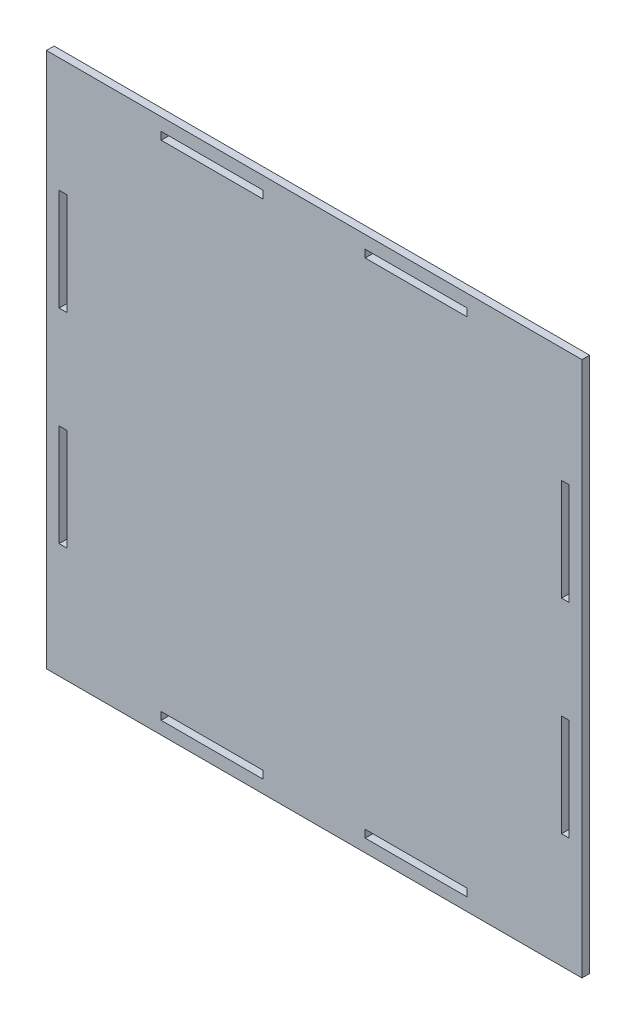
ISO-10303-21;
HEADER;
FILE_DESCRIPTION(('STEP AP214'),'2;1');
FILE_NAME('part.step','',(''),(''),'','','');
FILE_SCHEMA(('AUTOMOTIVE_DESIGN { 1 0 10303 214 1 1 1 1 }'));
ENDSEC;
DATA;
#1=APPLICATION_CONTEXT('core data for automotive mechanical design processes');
#2=APPLICATION_PROTOCOL_DEFINITION('international standard','automotive_design',2000,#1);
#3=PRODUCT_CONTEXT('',#1,'mechanical');
#4=PRODUCT('Part','Part','',(#3));
#5=PRODUCT_RELATED_PRODUCT_CATEGORY('part','',(#4));
#6=PRODUCT_DEFINITION_FORMATION('','',#4);
#7=PRODUCT_DEFINITION_CONTEXT('part definition',#1,'design');
#8=PRODUCT_DEFINITION('design','',#6,#7);
#9=PRODUCT_DEFINITION_SHAPE('','',#8);
#10=(LENGTH_UNIT() NAMED_UNIT(*) SI_UNIT(.MILLI.,.METRE.));
#11=(NAMED_UNIT(*) PLANE_ANGLE_UNIT() SI_UNIT($,.RADIAN.));
#12=(NAMED_UNIT(*) SI_UNIT($,.STERADIAN.) SOLID_ANGLE_UNIT());
#13=UNCERTAINTY_MEASURE_WITH_UNIT(LENGTH_MEASURE(1.E-05),#10,'distance_accuracy_value','');
#14=(GEOMETRIC_REPRESENTATION_CONTEXT(3) GLOBAL_UNCERTAINTY_ASSIGNED_CONTEXT((#13)) GLOBAL_UNIT_ASSIGNED_CONTEXT((#10,
#11,#12)) REPRESENTATION_CONTEXT('',''));
#15=CARTESIAN_POINT('',(0.,0.,0.));
#16=DIRECTION('',(0.,0.,1.));
#17=DIRECTION('',(1.,0.,0.));
#18=AXIS2_PLACEMENT_3D('',#15,#16,#17);
#19=CARTESIAN_POINT('',(0.,0.,3.));
#20=DIRECTION('',(0.,1.,0.));
#21=DIRECTION('',(0.,0.,1.));
#22=AXIS2_PLACEMENT_3D('',#19,#20,#21);
#23=PLANE('',#22);
#24=DIRECTION('',(1.,0.,0.));
#25=VECTOR('',#24,1.);
#26=CARTESIAN_POINT('',(0.,0.,0.));
#27=LINE('',#26,#25);
#28=CARTESIAN_POINT('',(40.,0.,0.));
#29=VERTEX_POINT('',#28);
#30=CARTESIAN_POINT('',(80.,0.,0.));
#31=VERTEX_POINT('',#30);
#32=EDGE_CURVE('E416',#29,#31,#27,.T.);
#33=ORIENTED_EDGE('',*,*,#32,.T.);
#34=DIRECTION('',(0.,0.,-1.));
#35=VECTOR('',#34,1.);
#36=CARTESIAN_POINT('',(80.,0.,3.));
#37=LINE('',#36,#35);
#38=CARTESIAN_POINT('',(80.,0.,3.));
#39=VERTEX_POINT('',#38);
#40=EDGE_CURVE('E11',#39,#31,#37,.T.);
#41=ORIENTED_EDGE('',*,*,#40,.F.);
#42=DIRECTION('',(1.,0.,0.));
#43=VECTOR('',#42,1.);
#44=CARTESIAN_POINT('',(0.,0.,3.));
#45=LINE('',#44,#43);
#46=CARTESIAN_POINT('',(40.,0.,3.));
#47=VERTEX_POINT('',#46);
#48=EDGE_CURVE('E295',#47,#39,#45,.T.);
#49=ORIENTED_EDGE('',*,*,#48,.F.);
#50=DIRECTION('',(0.,0.,-1.));
#51=VECTOR('',#50,1.);
#52=CARTESIAN_POINT('',(40.,0.,3.));
#53=LINE('',#52,#51);
#54=EDGE_CURVE('E67',#47,#29,#53,.T.);
#55=ORIENTED_EDGE('',*,*,#54,.T.);
#56=EDGE_LOOP('',(#33,#41,#49,#55));
#57=FACE_BOUND('',#56,.T.);
#58=ADVANCED_FACE('F47',(#57),#23,.F.);
#59=CARTESIAN_POINT('',(80.,0.,3.));
#60=DIRECTION('',(1.,0.,0.));
#61=DIRECTION('',(0.,0.,-1.));
#62=AXIS2_PLACEMENT_3D('',#59,#60,#61);
#63=PLANE('',#62);
#64=DIRECTION('',(0.,-1.,0.));
#65=VECTOR('',#64,1.);
#66=CARTESIAN_POINT('',(80.,0.,0.));
#67=LINE('',#66,#65);
#68=CARTESIAN_POINT('',(80.,-3.,0.));
#69=VERTEX_POINT('',#68);
#70=EDGE_CURVE('E302',#31,#69,#67,.T.);
#71=ORIENTED_EDGE('',*,*,#70,.T.);
#72=DIRECTION('',(0.,0.,-1.));
#73=VECTOR('',#72,1.);
#74=CARTESIAN_POINT('',(80.,-3.,3.));
#75=LINE('',#74,#73);
#76=CARTESIAN_POINT('',(80.,-3.,3.));
#77=VERTEX_POINT('',#76);
#78=EDGE_CURVE('E58',#77,#69,#75,.T.);
#79=ORIENTED_EDGE('',*,*,#78,.F.);
#80=DIRECTION('',(0.,-1.,0.));
#81=VECTOR('',#80,1.);
#82=CARTESIAN_POINT('',(80.,0.,3.));
#83=LINE('',#82,#81);
#84=EDGE_CURVE('E289',#39,#77,#83,.T.);
#85=ORIENTED_EDGE('',*,*,#84,.F.);
#86=ORIENTED_EDGE('',*,*,#40,.T.);
#87=EDGE_LOOP('',(#71,#79,#85,#86));
#88=FACE_BOUND('',#87,.T.);
#89=ADVANCED_FACE('F301',(#88),#63,.F.);
#90=CARTESIAN_POINT('',(0.,-3.,3.));
#91=DIRECTION('',(0.,1.,0.));
#92=DIRECTION('',(0.,0.,1.));
#93=AXIS2_PLACEMENT_3D('',#90,#91,#92);
#94=PLANE('',#93);
#95=DIRECTION('',(1.,0.,0.));
#96=VECTOR('',#95,1.);
#97=CARTESIAN_POINT('',(0.,-3.,0.));
#98=LINE('',#97,#96);
#99=CARTESIAN_POINT('',(40.,-3.,0.));
#100=VERTEX_POINT('',#99);
#101=EDGE_CURVE('E438',#100,#69,#98,.T.);
#102=ORIENTED_EDGE('',*,*,#101,.F.);
#103=DIRECTION('',(0.,0.,-1.));
#104=VECTOR('',#103,1.);
#105=CARTESIAN_POINT('',(40.,-3.,3.));
#106=LINE('',#105,#104);
#107=CARTESIAN_POINT('',(40.,-3.,3.));
#108=VERTEX_POINT('',#107);
#109=EDGE_CURVE('E177',#108,#100,#106,.T.);
#110=ORIENTED_EDGE('',*,*,#109,.F.);
#111=DIRECTION('',(1.,0.,0.));
#112=VECTOR('',#111,1.);
#113=CARTESIAN_POINT('',(0.,-3.,3.));
#114=LINE('',#113,#112);
#115=EDGE_CURVE('E294',#108,#77,#114,.T.);
#116=ORIENTED_EDGE('',*,*,#115,.T.);
#117=ORIENTED_EDGE('',*,*,#78,.T.);
#118=EDGE_LOOP('',(#102,#110,#116,#117));
#119=FACE_BOUND('',#118,.T.);
#120=ADVANCED_FACE('F307',(#119),#94,.T.);
#121=CARTESIAN_POINT('',(0.,-80.,3.));
#122=DIRECTION('',(0.,1.,0.));
#123=DIRECTION('',(0.,0.,1.));
#124=AXIS2_PLACEMENT_3D('',#121,#122,#123);
#125=PLANE('',#124);
#126=DIRECTION('',(1.,0.,0.));
#127=VECTOR('',#126,1.);
#128=CARTESIAN_POINT('',(0.,-80.,0.));
#129=LINE('',#128,#127);
#130=CARTESIAN_POINT('',(3.11060286983426E-13,-80.,0.));
#131=VERTEX_POINT('',#130);
#132=CARTESIAN_POINT('',(3.00000000000001,-80.,0.));
#133=VERTEX_POINT('',#132);
#134=EDGE_CURVE('E424',#131,#133,#129,.T.);
#135=ORIENTED_EDGE('',*,*,#134,.F.);
#136=DIRECTION('',(0.,0.,-1.));
#137=VECTOR('',#136,1.);
#138=CARTESIAN_POINT('',(3.11060286983426E-13,-80.,3.));
#139=LINE('',#138,#137);
#140=CARTESIAN_POINT('',(3.11060286983426E-13,-80.,3.));
#141=VERTEX_POINT('',#140);
#142=EDGE_CURVE('E448',#141,#131,#139,.T.);
#143=ORIENTED_EDGE('',*,*,#142,.F.);
#144=DIRECTION('',(1.,0.,0.));
#145=VECTOR('',#144,1.);
#146=CARTESIAN_POINT('',(0.,-80.,3.));
#147=LINE('',#146,#145);
#148=CARTESIAN_POINT('',(3.00000000000001,-80.,3.));
#149=VERTEX_POINT('',#148);
#150=EDGE_CURVE('E659',#141,#149,#147,.T.);
#151=ORIENTED_EDGE('',*,*,#150,.T.);
#152=DIRECTION('',(0.,0.,-1.));
#153=VECTOR('',#152,1.);
#154=CARTESIAN_POINT('',(3.00000000000001,-80.,3.));
#155=LINE('',#154,#153);
#156=EDGE_CURVE('E451',#149,#133,#155,.T.);
#157=ORIENTED_EDGE('',*,*,#156,.T.);
#158=EDGE_LOOP('',(#135,#143,#151,#157));
#159=FACE_BOUND('',#158,.T.);
#160=ADVANCED_FACE('F680',(#159),#125,.T.);
#161=CARTESIAN_POINT('',(1.00421037530082E-12,0.,3.));
#162=DIRECTION('',(1.,0.,0.));
#163=DIRECTION('',(0.,1.,0.));
#164=AXIS2_PLACEMENT_3D('',#161,#162,#163);
#165=PLANE('',#164);
#166=DIRECTION('',(0.,-1.,0.));
#167=VECTOR('',#166,1.);
#168=CARTESIAN_POINT('',(1.00421037530082E-12,0.,0.));
#169=LINE('',#168,#167);
#170=CARTESIAN_POINT('',(4.06582737316919E-13,-40.,0.));
#171=VERTEX_POINT('',#170);
#172=EDGE_CURVE('E387',#171,#131,#169,.T.);
#173=ORIENTED_EDGE('',*,*,#172,.F.);
#174=DIRECTION('',(0.,0.,-1.));
#175=VECTOR('',#174,1.);
#176=CARTESIAN_POINT('',(4.06582737316919E-13,-40.,3.));
#177=LINE('',#176,#175);
#178=CARTESIAN_POINT('',(4.06582737316919E-13,-40.,3.));
#179=VERTEX_POINT('',#178);
#180=EDGE_CURVE('E459',#179,#171,#177,.T.);
#181=ORIENTED_EDGE('',*,*,#180,.F.);
#182=DIRECTION('',(0.,-1.,0.));
#183=VECTOR('',#182,1.);
#184=CARTESIAN_POINT('',(1.00421037530082E-12,0.,3.));
#185=LINE('',#184,#183);
#186=EDGE_CURVE('E626',#179,#141,#185,.T.);
#187=ORIENTED_EDGE('',*,*,#186,.T.);
#188=ORIENTED_EDGE('',*,*,#142,.T.);
#189=EDGE_LOOP('',(#173,#181,#187,#188));
#190=FACE_BOUND('',#189,.T.);
#191=ADVANCED_FACE('F684',(#190),#165,.T.);
#192=CARTESIAN_POINT('',(0.,-40.,3.));
#193=DIRECTION('',(0.,1.,0.));
#194=DIRECTION('',(0.,0.,1.));
#195=AXIS2_PLACEMENT_3D('',#192,#193,#194);
#196=PLANE('',#195);
#197=DIRECTION('',(1.,0.,0.));
#198=VECTOR('',#197,1.);
#199=CARTESIAN_POINT('',(0.,-40.,0.));
#200=LINE('',#199,#198);
#201=CARTESIAN_POINT('',(3.,-40.,0.));
#202=VERTEX_POINT('',#201);
#203=EDGE_CURVE('E428',#171,#202,#200,.T.);
#204=ORIENTED_EDGE('',*,*,#203,.T.);
#205=DIRECTION('',(0.,0.,-1.));
#206=VECTOR('',#205,1.);
#207=CARTESIAN_POINT('',(3.,-40.,3.));
#208=LINE('',#207,#206);
#209=CARTESIAN_POINT('',(3.,-40.,3.));
#210=VERTEX_POINT('',#209);
#211=EDGE_CURVE('E454',#210,#202,#208,.T.);
#212=ORIENTED_EDGE('',*,*,#211,.F.);
#213=DIRECTION('',(1.,0.,0.));
#214=VECTOR('',#213,1.);
#215=CARTESIAN_POINT('',(0.,-40.,3.));
#216=LINE('',#215,#214);
#217=EDGE_CURVE('E663',#179,#210,#216,.T.);
#218=ORIENTED_EDGE('',*,*,#217,.F.);
#219=ORIENTED_EDGE('',*,*,#180,.T.);
#220=EDGE_LOOP('',(#204,#212,#218,#219));
#221=FACE_BOUND('',#220,.T.);
#222=ADVANCED_FACE('F762',(#221),#196,.F.);
#223=CARTESIAN_POINT('',(120.,0.,3.));
#224=DIRECTION('',(1.,0.,0.));
#225=DIRECTION('',(0.,0.,-1.));
#226=AXIS2_PLACEMENT_3D('',#223,#224,#225);
#227=PLANE('',#226);
#228=DIRECTION('',(0.,-1.,0.));
#229=VECTOR('',#228,1.);
#230=CARTESIAN_POINT('',(120.,0.,0.));
#231=LINE('',#230,#229);
#232=CARTESIAN_POINT('',(120.,0.,0.));
#233=VERTEX_POINT('',#232);
#234=CARTESIAN_POINT('',(120.,-2.99999999999999,0.));
#235=VERTEX_POINT('',#234);
#236=EDGE_CURVE('E407',#233,#235,#231,.T.);
#237=ORIENTED_EDGE('',*,*,#236,.F.);
#238=DIRECTION('',(0.,0.,-1.));
#239=VECTOR('',#238,1.);
#240=CARTESIAN_POINT('',(120.,0.,3.));
#241=LINE('',#240,#239);
#242=CARTESIAN_POINT('',(120.,0.,3.));
#243=VERTEX_POINT('',#242);
#244=EDGE_CURVE('E455',#243,#233,#241,.T.);
#245=ORIENTED_EDGE('',*,*,#244,.F.);
#246=DIRECTION('',(0.,-1.,0.));
#247=VECTOR('',#246,1.);
#248=CARTESIAN_POINT('',(120.,0.,3.));
#249=LINE('',#248,#247);
#250=CARTESIAN_POINT('',(120.,-2.99999999999999,3.));
#251=VERTEX_POINT('',#250);
#252=EDGE_CURVE('E644',#243,#251,#249,.T.);
#253=ORIENTED_EDGE('',*,*,#252,.T.);
#254=DIRECTION('',(0.,0.,-1.));
#255=VECTOR('',#254,1.);
#256=CARTESIAN_POINT('',(120.,-2.99999999999999,3.));
#257=LINE('',#256,#255);
#258=EDGE_CURVE('E464',#251,#235,#257,.T.);
#259=ORIENTED_EDGE('',*,*,#258,.T.);
#260=EDGE_LOOP('',(#237,#245,#253,#259));
#261=FACE_BOUND('',#260,.T.);
#262=ADVANCED_FACE('F753',(#261),#227,.T.);
#263=CARTESIAN_POINT('',(160.,0.,0.));
#264=VERTEX_POINT('',#263);
#265=EDGE_CURVE('E411',#233,#264,#27,.T.);
#266=ORIENTED_EDGE('',*,*,#265,.T.);
#267=DIRECTION('',(0.,0.,-1.));
#268=VECTOR('',#267,1.);
#269=CARTESIAN_POINT('',(160.,0.,3.));
#270=LINE('',#269,#268);
#271=CARTESIAN_POINT('',(160.,0.,3.));
#272=VERTEX_POINT('',#271);
#273=EDGE_CURVE('E472',#272,#264,#270,.T.);
#274=ORIENTED_EDGE('',*,*,#273,.F.);
#275=EDGE_CURVE('E648',#243,#272,#45,.T.);
#276=ORIENTED_EDGE('',*,*,#275,.F.);
#277=ORIENTED_EDGE('',*,*,#244,.T.);
#278=EDGE_LOOP('',(#266,#274,#276,#277));
#279=FACE_BOUND('',#278,.T.);
#280=ADVANCED_FACE('F745',(#279),#23,.F.);
#281=CARTESIAN_POINT('',(160.,0.,3.));
#282=DIRECTION('',(1.,0.,0.));
#283=DIRECTION('',(0.,0.,-1.));
#284=AXIS2_PLACEMENT_3D('',#281,#282,#283);
#285=PLANE('',#284);
#286=DIRECTION('',(0.,-1.,0.));
#287=VECTOR('',#286,1.);
#288=CARTESIAN_POINT('',(160.,0.,0.));
#289=LINE('',#288,#287);
#290=CARTESIAN_POINT('',(160.,-2.99999999999998,0.));
#291=VERTEX_POINT('',#290);
#292=EDGE_CURVE('E415',#264,#291,#289,.T.);
#293=ORIENTED_EDGE('',*,*,#292,.T.);
#294=DIRECTION('',(0.,0.,-1.));
#295=VECTOR('',#294,1.);
#296=CARTESIAN_POINT('',(160.,-2.99999999999998,3.));
#297=LINE('',#296,#295);
#298=CARTESIAN_POINT('',(160.,-2.99999999999998,3.));
#299=VERTEX_POINT('',#298);
#300=EDGE_CURVE('E467',#299,#291,#297,.T.);
#301=ORIENTED_EDGE('',*,*,#300,.F.);
#302=DIRECTION('',(0.,-1.,0.));
#303=VECTOR('',#302,1.);
#304=CARTESIAN_POINT('',(160.,0.,3.));
#305=LINE('',#304,#303);
#306=EDGE_CURVE('E652',#272,#299,#305,.T.);
#307=ORIENTED_EDGE('',*,*,#306,.F.);
#308=ORIENTED_EDGE('',*,*,#273,.T.);
#309=EDGE_LOOP('',(#293,#301,#307,#308));
#310=FACE_BOUND('',#309,.T.);
#311=ADVANCED_FACE('F752',(#310),#285,.F.);
#312=CARTESIAN_POINT('',(0.,-40.,3.));
#313=DIRECTION('',(0.,-1.,0.));
#314=DIRECTION('',(0.,0.,-1.));
#315=AXIS2_PLACEMENT_3D('',#312,#313,#314);
#316=PLANE('',#315);
#317=DIRECTION('',(-1.,0.,0.));
#318=VECTOR('',#317,1.);
#319=CARTESIAN_POINT('',(0.,-40.,0.));
#320=LINE('',#319,#318);
#321=CARTESIAN_POINT('',(200.,-40.,0.));
#322=VERTEX_POINT('',#321);
#323=CARTESIAN_POINT('',(197.,-40.,0.));
#324=VERTEX_POINT('',#323);
#325=EDGE_CURVE('E395',#322,#324,#320,.T.);
#326=ORIENTED_EDGE('',*,*,#325,.F.);
#327=DIRECTION('',(0.,0.,-1.));
#328=VECTOR('',#327,1.);
#329=CARTESIAN_POINT('',(200.,-40.,3.));
#330=LINE('',#329,#328);
#331=CARTESIAN_POINT('',(200.,-40.,3.));
#332=VERTEX_POINT('',#331);
#333=EDGE_CURVE('E468',#332,#322,#330,.T.);
#334=ORIENTED_EDGE('',*,*,#333,.F.);
#335=DIRECTION('',(-1.,0.,0.));
#336=VECTOR('',#335,1.);
#337=CARTESIAN_POINT('',(0.,-40.,3.));
#338=LINE('',#337,#336);
#339=CARTESIAN_POINT('',(197.,-40.,3.));
#340=VERTEX_POINT('',#339);
#341=EDGE_CURVE('E633',#332,#340,#338,.T.);
#342=ORIENTED_EDGE('',*,*,#341,.T.);
#343=DIRECTION('',(0.,0.,-1.));
#344=VECTOR('',#343,1.);
#345=CARTESIAN_POINT('',(197.,-40.,3.));
#346=LINE('',#345,#344);
#347=EDGE_CURVE('E478',#340,#324,#346,.T.);
#348=ORIENTED_EDGE('',*,*,#347,.T.);
#349=EDGE_LOOP('',(#326,#334,#342,#348));
#350=FACE_BOUND('',#349,.T.);
#351=ADVANCED_FACE('F759',(#350),#316,.T.);
#352=CARTESIAN_POINT('',(200.,-2.22044604925031E-12,3.));
#353=DIRECTION('',(-1.,0.,0.));
#354=DIRECTION('',(0.,-1.,0.));
#355=AXIS2_PLACEMENT_3D('',#352,#353,#354);
#356=PLANE('',#355);
#357=DIRECTION('',(0.,1.,0.));
#358=VECTOR('',#357,1.);
#359=CARTESIAN_POINT('',(200.,-2.22044604925031E-12,0.));
#360=LINE('',#359,#358);
#361=CARTESIAN_POINT('',(200.,-80.,0.));
#362=VERTEX_POINT('',#361);
#363=EDGE_CURVE('E354',#362,#322,#360,.T.);
#364=ORIENTED_EDGE('',*,*,#363,.F.);
#365=DIRECTION('',(0.,0.,-1.));
#366=VECTOR('',#365,1.);
#367=CARTESIAN_POINT('',(200.,-80.,3.));
#368=LINE('',#367,#366);
#369=CARTESIAN_POINT('',(200.,-80.,3.));
#370=VERTEX_POINT('',#369);
#371=EDGE_CURVE('E485',#370,#362,#368,.T.);
#372=ORIENTED_EDGE('',*,*,#371,.F.);
#373=DIRECTION('',(0.,1.,0.));
#374=VECTOR('',#373,1.);
#375=CARTESIAN_POINT('',(200.,-2.22044604925031E-12,3.));
#376=LINE('',#375,#374);
#377=EDGE_CURVE('E595',#370,#332,#376,.T.);
#378=ORIENTED_EDGE('',*,*,#377,.T.);
#379=ORIENTED_EDGE('',*,*,#333,.T.);
#380=EDGE_LOOP('',(#364,#372,#378,#379));
#381=FACE_BOUND('',#380,.T.);
#382=ADVANCED_FACE('F794',(#381),#356,.T.);
#383=CARTESIAN_POINT('',(0.,-80.,3.));
#384=DIRECTION('',(0.,-1.,0.));
#385=DIRECTION('',(0.,0.,-1.));
#386=AXIS2_PLACEMENT_3D('',#383,#384,#385);
#387=PLANE('',#386);
#388=DIRECTION('',(-1.,0.,0.));
#389=VECTOR('',#388,1.);
#390=CARTESIAN_POINT('',(0.,-80.,0.));
#391=LINE('',#390,#389);
#392=CARTESIAN_POINT('',(197.,-80.,0.));
#393=VERTEX_POINT('',#392);
#394=EDGE_CURVE('E399',#362,#393,#391,.T.);
#395=ORIENTED_EDGE('',*,*,#394,.T.);
#396=DIRECTION('',(0.,0.,-1.));
#397=VECTOR('',#396,1.);
#398=CARTESIAN_POINT('',(197.,-80.,3.));
#399=LINE('',#398,#397);
#400=CARTESIAN_POINT('',(197.,-80.,3.));
#401=VERTEX_POINT('',#400);
#402=EDGE_CURVE('E481',#401,#393,#399,.T.);
#403=ORIENTED_EDGE('',*,*,#402,.F.);
#404=DIRECTION('',(-1.,0.,0.));
#405=VECTOR('',#404,1.);
#406=CARTESIAN_POINT('',(0.,-80.,3.));
#407=LINE('',#406,#405);
#408=EDGE_CURVE('E637',#370,#401,#407,.T.);
#409=ORIENTED_EDGE('',*,*,#408,.F.);
#410=ORIENTED_EDGE('',*,*,#371,.T.);
#411=EDGE_LOOP('',(#395,#403,#409,#410));
#412=FACE_BOUND('',#411,.T.);
#413=ADVANCED_FACE('F790',(#412),#387,.F.);
#414=CARTESIAN_POINT('',(0.,-160.,3.));
#415=DIRECTION('',(0.,1.,0.));
#416=DIRECTION('',(0.,0.,1.));
#417=AXIS2_PLACEMENT_3D('',#414,#415,#416);
#418=PLANE('',#417);
#419=DIRECTION('',(1.,0.,0.));
#420=VECTOR('',#419,1.);
#421=CARTESIAN_POINT('',(0.,-160.,0.));
#422=LINE('',#421,#420);
#423=CARTESIAN_POINT('',(1.2001538631644E-13,-160.,0.));
#424=VERTEX_POINT('',#423);
#425=CARTESIAN_POINT('',(3.,-160.,0.));
#426=VERTEX_POINT('',#425);
#427=EDGE_CURVE('E378',#424,#426,#422,.T.);
#428=ORIENTED_EDGE('',*,*,#427,.F.);
#429=DIRECTION('',(0.,0.,-1.));
#430=VECTOR('',#429,1.);
#431=CARTESIAN_POINT('',(1.2001538631644E-13,-160.,3.));
#432=LINE('',#431,#430);
#433=CARTESIAN_POINT('',(1.2001538631644E-13,-160.,3.));
#434=VERTEX_POINT('',#433);
#435=EDGE_CURVE('E482',#434,#424,#432,.T.);
#436=ORIENTED_EDGE('',*,*,#435,.F.);
#437=DIRECTION('',(1.,0.,0.));
#438=VECTOR('',#437,1.);
#439=CARTESIAN_POINT('',(0.,-160.,3.));
#440=LINE('',#439,#438);
#441=CARTESIAN_POINT('',(3.,-160.,3.));
#442=VERTEX_POINT('',#441);
#443=EDGE_CURVE('E617',#434,#442,#440,.T.);
#444=ORIENTED_EDGE('',*,*,#443,.T.);
#445=DIRECTION('',(0.,0.,-1.));
#446=VECTOR('',#445,1.);
#447=CARTESIAN_POINT('',(3.,-160.,3.));
#448=LINE('',#447,#446);
#449=EDGE_CURVE('E490',#442,#426,#448,.T.);
#450=ORIENTED_EDGE('',*,*,#449,.T.);
#451=EDGE_LOOP('',(#428,#436,#444,#450));
#452=FACE_BOUND('',#451,.T.);
#453=ADVANCED_FACE('F793',(#452),#418,.T.);
#454=CARTESIAN_POINT('',(2.15537836649933E-13,-120.,0.));
#455=VERTEX_POINT('',#454);
#456=EDGE_CURVE('E382',#455,#424,#169,.T.);
#457=ORIENTED_EDGE('',*,*,#456,.F.);
#458=DIRECTION('',(0.,0.,-1.));
#459=VECTOR('',#458,1.);
#460=CARTESIAN_POINT('',(2.15537836649933E-13,-120.,3.));
#461=LINE('',#460,#459);
#462=CARTESIAN_POINT('',(2.15537836649933E-13,-120.,3.));
#463=VERTEX_POINT('',#462);
#464=EDGE_CURVE('E497',#463,#455,#461,.T.);
#465=ORIENTED_EDGE('',*,*,#464,.F.);
#466=EDGE_CURVE('E621',#463,#434,#185,.T.);
#467=ORIENTED_EDGE('',*,*,#466,.T.);
#468=ORIENTED_EDGE('',*,*,#435,.T.);
#469=EDGE_LOOP('',(#457,#465,#467,#468));
#470=FACE_BOUND('',#469,.T.);
#471=ADVANCED_FACE('F808',(#470),#165,.T.);
#472=CARTESIAN_POINT('',(0.,-120.,3.));
#473=DIRECTION('',(0.,1.,0.));
#474=DIRECTION('',(0.,0.,1.));
#475=AXIS2_PLACEMENT_3D('',#472,#473,#474);
#476=PLANE('',#475);
#477=DIRECTION('',(1.,0.,0.));
#478=VECTOR('',#477,1.);
#479=CARTESIAN_POINT('',(0.,-120.,0.));
#480=LINE('',#479,#478);
#481=CARTESIAN_POINT('',(3.00000000000001,-120.,0.));
#482=VERTEX_POINT('',#481);
#483=EDGE_CURVE('E386',#455,#482,#480,.T.);
#484=ORIENTED_EDGE('',*,*,#483,.T.);
#485=DIRECTION('',(0.,0.,-1.));
#486=VECTOR('',#485,1.);
#487=CARTESIAN_POINT('',(3.00000000000001,-120.,3.));
#488=LINE('',#487,#486);
#489=CARTESIAN_POINT('',(3.00000000000001,-120.,3.));
#490=VERTEX_POINT('',#489);
#491=EDGE_CURVE('E493',#490,#482,#488,.T.);
#492=ORIENTED_EDGE('',*,*,#491,.F.);
#493=DIRECTION('',(1.,0.,0.));
#494=VECTOR('',#493,1.);
#495=CARTESIAN_POINT('',(0.,-120.,3.));
#496=LINE('',#495,#494);
#497=EDGE_CURVE('E625',#463,#490,#496,.T.);
#498=ORIENTED_EDGE('',*,*,#497,.F.);
#499=ORIENTED_EDGE('',*,*,#464,.T.);
#500=EDGE_LOOP('',(#484,#492,#498,#499));
#501=FACE_BOUND('',#500,.T.);
#502=ADVANCED_FACE('F805',(#501),#476,.F.);
#503=CARTESIAN_POINT('',(0.,-200.,3.));
#504=DIRECTION('',(0.,1.,0.));
#505=DIRECTION('',(0.,0.,1.));
#506=AXIS2_PLACEMENT_3D('',#503,#504,#505);
#507=PLANE('',#506);
#508=DIRECTION('',(1.,0.,0.));
#509=VECTOR('',#508,1.);
#510=CARTESIAN_POINT('',(0.,-200.,0.));
#511=LINE('',#510,#509);
#512=CARTESIAN_POINT('',(40.,-200.,0.));
#513=VERTEX_POINT('',#512);
#514=CARTESIAN_POINT('',(80.,-200.,0.));
#515=VERTEX_POINT('',#514);
#516=EDGE_CURVE('E337',#513,#515,#511,.T.);
#517=ORIENTED_EDGE('',*,*,#516,.F.);
#518=DIRECTION('',(0.,0.,-1.));
#519=VECTOR('',#518,1.);
#520=CARTESIAN_POINT('',(40.,-200.,3.));
#521=LINE('',#520,#519);
#522=CARTESIAN_POINT('',(40.,-200.,3.));
#523=VERTEX_POINT('',#522);
#524=EDGE_CURVE('E494',#523,#513,#521,.T.);
#525=ORIENTED_EDGE('',*,*,#524,.F.);
#526=DIRECTION('',(1.,0.,0.));
#527=VECTOR('',#526,1.);
#528=CARTESIAN_POINT('',(0.,-200.,3.));
#529=LINE('',#528,#527);
#530=CARTESIAN_POINT('',(80.,-200.,3.));
#531=VERTEX_POINT('',#530);
#532=EDGE_CURVE('E576',#523,#531,#529,.T.);
#533=ORIENTED_EDGE('',*,*,#532,.T.);
#534=DIRECTION('',(0.,0.,-1.));
#535=VECTOR('',#534,1.);
#536=CARTESIAN_POINT('',(80.,-200.,3.));
#537=LINE('',#536,#535);
#538=EDGE_CURVE('E502',#531,#515,#537,.T.);
#539=ORIENTED_EDGE('',*,*,#538,.T.);
#540=EDGE_LOOP('',(#517,#525,#533,#539));
#541=FACE_BOUND('',#540,.T.);
#542=ADVANCED_FACE('F694',(#541),#507,.T.);
#543=CARTESIAN_POINT('',(40.,0.,3.));
#544=DIRECTION('',(-1.,0.,0.));
#545=DIRECTION('',(0.,0.,1.));
#546=AXIS2_PLACEMENT_3D('',#543,#544,#545);
#547=PLANE('',#546);
#548=DIRECTION('',(0.,1.,0.));
#549=VECTOR('',#548,1.);
#550=CARTESIAN_POINT('',(40.,0.,0.));
#551=LINE('',#550,#549);
#552=CARTESIAN_POINT('',(40.,-197.,0.));
#553=VERTEX_POINT('',#552);
#554=EDGE_CURVE('E366',#513,#553,#551,.T.);
#555=ORIENTED_EDGE('',*,*,#554,.T.);
#556=DIRECTION('',(0.,0.,-1.));
#557=VECTOR('',#556,1.);
#558=CARTESIAN_POINT('',(40.,-197.,3.));
#559=LINE('',#558,#557);
#560=CARTESIAN_POINT('',(40.,-197.,3.));
#561=VERTEX_POINT('',#560);
#562=EDGE_CURVE('E509',#561,#553,#559,.T.);
#563=ORIENTED_EDGE('',*,*,#562,.F.);
#564=DIRECTION('',(0.,1.,0.));
#565=VECTOR('',#564,1.);
#566=CARTESIAN_POINT('',(40.,0.,3.));
#567=LINE('',#566,#565);
#568=EDGE_CURVE('E606',#523,#561,#567,.T.);
#569=ORIENTED_EDGE('',*,*,#568,.F.);
#570=ORIENTED_EDGE('',*,*,#524,.T.);
#571=EDGE_LOOP('',(#555,#563,#569,#570));
#572=FACE_BOUND('',#571,.T.);
#573=ADVANCED_FACE('F818',(#572),#547,.F.);
#574=CARTESIAN_POINT('',(0.,-197.,3.));
#575=DIRECTION('',(0.,1.,0.));
#576=DIRECTION('',(0.,0.,1.));
#577=AXIS2_PLACEMENT_3D('',#574,#575,#576);
#578=PLANE('',#577);
#579=DIRECTION('',(1.,0.,0.));
#580=VECTOR('',#579,1.);
#581=CARTESIAN_POINT('',(0.,-197.,0.));
#582=LINE('',#581,#580);
#583=CARTESIAN_POINT('',(80.,-197.,0.));
#584=VERTEX_POINT('',#583);
#585=EDGE_CURVE('E370',#553,#584,#582,.T.);
#586=ORIENTED_EDGE('',*,*,#585,.T.);
#587=DIRECTION('',(0.,0.,-1.));
#588=VECTOR('',#587,1.);
#589=CARTESIAN_POINT('',(80.,-197.,3.));
#590=LINE('',#589,#588);
#591=CARTESIAN_POINT('',(80.,-197.,3.));
#592=VERTEX_POINT('',#591);
#593=EDGE_CURVE('E505',#592,#584,#590,.T.);
#594=ORIENTED_EDGE('',*,*,#593,.F.);
#595=DIRECTION('',(1.,0.,0.));
#596=VECTOR('',#595,1.);
#597=CARTESIAN_POINT('',(0.,-197.,3.));
#598=LINE('',#597,#596);
#599=EDGE_CURVE('E610',#561,#592,#598,.T.);
#600=ORIENTED_EDGE('',*,*,#599,.F.);
#601=ORIENTED_EDGE('',*,*,#562,.T.);
#602=EDGE_LOOP('',(#586,#594,#600,#601));
#603=FACE_BOUND('',#602,.T.);
#604=ADVANCED_FACE('F815',(#603),#578,.F.);
#605=CARTESIAN_POINT('',(199.999999999999,-160.,0.));
#606=VERTEX_POINT('',#605);
#607=CARTESIAN_POINT('',(199.999999999999,-120.,0.));
#608=VERTEX_POINT('',#607);
#609=EDGE_CURVE('E349',#606,#608,#360,.T.);
#610=ORIENTED_EDGE('',*,*,#609,.F.);
#611=DIRECTION('',(0.,0.,-1.));
#612=VECTOR('',#611,1.);
#613=CARTESIAN_POINT('',(199.999999999999,-160.,3.));
#614=LINE('',#613,#612);
#615=CARTESIAN_POINT('',(199.999999999999,-160.,3.));
#616=VERTEX_POINT('',#615);
#617=EDGE_CURVE('E506',#616,#606,#614,.T.);
#618=ORIENTED_EDGE('',*,*,#617,.F.);
#619=CARTESIAN_POINT('',(199.999999999999,-120.,3.));
#620=VERTEX_POINT('',#619);
#621=EDGE_CURVE('E590',#616,#620,#376,.T.);
#622=ORIENTED_EDGE('',*,*,#621,.T.);
#623=DIRECTION('',(0.,0.,-1.));
#624=VECTOR('',#623,1.);
#625=CARTESIAN_POINT('',(199.999999999999,-120.,3.));
#626=LINE('',#625,#624);
#627=EDGE_CURVE('E515',#620,#608,#626,.T.);
#628=ORIENTED_EDGE('',*,*,#627,.T.);
#629=EDGE_LOOP('',(#610,#618,#622,#628));
#630=FACE_BOUND('',#629,.T.);
#631=ADVANCED_FACE('F727',(#630),#356,.T.);
#632=CARTESIAN_POINT('',(0.,-160.,3.));
#633=DIRECTION('',(0.,-1.,0.));
#634=DIRECTION('',(0.,0.,-1.));
#635=AXIS2_PLACEMENT_3D('',#632,#633,#634);
#636=PLANE('',#635);
#637=DIRECTION('',(-1.,0.,0.));
#638=VECTOR('',#637,1.);
#639=CARTESIAN_POINT('',(0.,-160.,0.));
#640=LINE('',#639,#638);
#641=CARTESIAN_POINT('',(197.,-160.,0.));
#642=VERTEX_POINT('',#641);
#643=EDGE_CURVE('E353',#606,#642,#640,.T.);
#644=ORIENTED_EDGE('',*,*,#643,.T.);
#645=DIRECTION('',(0.,0.,-1.));
#646=VECTOR('',#645,1.);
#647=CARTESIAN_POINT('',(197.,-160.,3.));
#648=LINE('',#647,#646);
#649=CARTESIAN_POINT('',(197.,-160.,3.));
#650=VERTEX_POINT('',#649);
#651=EDGE_CURVE('E522',#650,#642,#648,.T.);
#652=ORIENTED_EDGE('',*,*,#651,.F.);
#653=DIRECTION('',(-1.,0.,0.));
#654=VECTOR('',#653,1.);
#655=CARTESIAN_POINT('',(0.,-160.,3.));
#656=LINE('',#655,#654);
#657=EDGE_CURVE('E594',#616,#650,#656,.T.);
#658=ORIENTED_EDGE('',*,*,#657,.F.);
#659=ORIENTED_EDGE('',*,*,#617,.T.);
#660=EDGE_LOOP('',(#644,#652,#658,#659));
#661=FACE_BOUND('',#660,.T.);
#662=ADVANCED_FACE('F730',(#661),#636,.F.);
#663=CARTESIAN_POINT('',(197.,-1.36696209906973E-13,3.));
#664=DIRECTION('',(-1.,0.,0.));
#665=DIRECTION('',(0.,-1.,0.));
#666=AXIS2_PLACEMENT_3D('',#663,#664,#665);
#667=PLANE('',#666);
#668=DIRECTION('',(0.,1.,0.));
#669=VECTOR('',#668,1.);
#670=CARTESIAN_POINT('',(197.,-1.36696209906973E-13,0.));
#671=LINE('',#670,#669);
#672=CARTESIAN_POINT('',(197.,-120.,0.));
#673=VERTEX_POINT('',#672);
#674=EDGE_CURVE('E358',#642,#673,#671,.T.);
#675=ORIENTED_EDGE('',*,*,#674,.T.);
#676=DIRECTION('',(0.,0.,-1.));
#677=VECTOR('',#676,1.);
#678=CARTESIAN_POINT('',(197.,-120.,3.));
#679=LINE('',#678,#677);
#680=CARTESIAN_POINT('',(197.,-120.,3.));
#681=VERTEX_POINT('',#680);
#682=EDGE_CURVE('E518',#681,#673,#679,.T.);
#683=ORIENTED_EDGE('',*,*,#682,.F.);
#684=DIRECTION('',(0.,1.,0.));
#685=VECTOR('',#684,1.);
#686=CARTESIAN_POINT('',(197.,-1.36696209906973E-13,3.));
#687=LINE('',#686,#685);
#688=EDGE_CURVE('E599',#650,#681,#687,.T.);
#689=ORIENTED_EDGE('',*,*,#688,.F.);
#690=ORIENTED_EDGE('',*,*,#651,.T.);
#691=EDGE_LOOP('',(#675,#683,#689,#690));
#692=FACE_BOUND('',#691,.T.);
#693=ADVANCED_FACE('F732',(#692),#667,.F.);
#694=CARTESIAN_POINT('',(120.,-200.,0.));
#695=VERTEX_POINT('',#694);
#696=CARTESIAN_POINT('',(160.,-200.,0.));
#697=VERTEX_POINT('',#696);
#698=EDGE_CURVE('E332',#695,#697,#511,.T.);
#699=ORIENTED_EDGE('',*,*,#698,.F.);
#700=DIRECTION('',(0.,0.,-1.));
#701=VECTOR('',#700,1.);
#702=CARTESIAN_POINT('',(120.,-200.,3.));
#703=LINE('',#702,#701);
#704=CARTESIAN_POINT('',(120.,-200.,3.));
#705=VERTEX_POINT('',#704);
#706=EDGE_CURVE('E519',#705,#695,#703,.T.);
#707=ORIENTED_EDGE('',*,*,#706,.F.);
#708=CARTESIAN_POINT('',(160.,-200.,3.));
#709=VERTEX_POINT('',#708);
#710=EDGE_CURVE('E569',#705,#709,#529,.T.);
#711=ORIENTED_EDGE('',*,*,#710,.T.);
#712=DIRECTION('',(0.,0.,-1.));
#713=VECTOR('',#712,1.);
#714=CARTESIAN_POINT('',(160.,-200.,3.));
#715=LINE('',#714,#713);
#716=EDGE_CURVE('E528',#709,#697,#715,.T.);
#717=ORIENTED_EDGE('',*,*,#716,.T.);
#718=EDGE_LOOP('',(#699,#707,#711,#717));
#719=FACE_BOUND('',#718,.T.);
#720=ADVANCED_FACE('F825',(#719),#507,.T.);
#721=CARTESIAN_POINT('',(120.,0.,3.));
#722=DIRECTION('',(-1.,0.,0.));
#723=DIRECTION('',(0.,0.,1.));
#724=AXIS2_PLACEMENT_3D('',#721,#722,#723);
#725=PLANE('',#724);
#726=DIRECTION('',(0.,1.,0.));
#727=VECTOR('',#726,1.);
#728=CARTESIAN_POINT('',(120.,0.,0.));
#729=LINE('',#728,#727);
#730=CARTESIAN_POINT('',(120.,-197.,0.));
#731=VERTEX_POINT('',#730);
#732=EDGE_CURVE('E336',#695,#731,#729,.T.);
#733=ORIENTED_EDGE('',*,*,#732,.T.);
#734=DIRECTION('',(0.,0.,-1.));
#735=VECTOR('',#734,1.);
#736=CARTESIAN_POINT('',(120.,-197.,3.));
#737=LINE('',#736,#735);
#738=CARTESIAN_POINT('',(120.,-197.,3.));
#739=VERTEX_POINT('',#738);
#740=EDGE_CURVE('E534',#739,#731,#737,.T.);
#741=ORIENTED_EDGE('',*,*,#740,.F.);
#742=DIRECTION('',(0.,1.,0.));
#743=VECTOR('',#742,1.);
#744=CARTESIAN_POINT('',(120.,0.,3.));
#745=LINE('',#744,#743);
#746=EDGE_CURVE('E574',#705,#739,#745,.T.);
#747=ORIENTED_EDGE('',*,*,#746,.F.);
#748=ORIENTED_EDGE('',*,*,#706,.T.);
#749=EDGE_LOOP('',(#733,#741,#747,#748));
#750=FACE_BOUND('',#749,.T.);
#751=ADVANCED_FACE('F839',(#750),#725,.F.);
#752=CARTESIAN_POINT('',(1.36696209906973E-13,-197.,3.));
#753=DIRECTION('',(0.,-1.,0.));
#754=DIRECTION('',(1.,0.,0.));
#755=AXIS2_PLACEMENT_3D('',#752,#753,#754);
#756=PLANE('',#755);
#757=DIRECTION('',(-1.,0.,0.));
#758=VECTOR('',#757,1.);
#759=CARTESIAN_POINT('',(1.36696209906973E-13,-197.,0.));
#760=LINE('',#759,#758);
#761=CARTESIAN_POINT('',(160.,-197.,0.));
#762=VERTEX_POINT('',#761);
#763=EDGE_CURVE('E341',#762,#731,#760,.T.);
#764=ORIENTED_EDGE('',*,*,#763,.F.);
#765=DIRECTION('',(0.,0.,-1.));
#766=VECTOR('',#765,1.);
#767=CARTESIAN_POINT('',(160.,-197.,3.));
#768=LINE('',#767,#766);
#769=CARTESIAN_POINT('',(160.,-197.,3.));
#770=VERTEX_POINT('',#769);
#771=EDGE_CURVE('E531',#770,#762,#768,.T.);
#772=ORIENTED_EDGE('',*,*,#771,.F.);
#773=DIRECTION('',(-1.,0.,0.));
#774=VECTOR('',#773,1.);
#775=CARTESIAN_POINT('',(1.36696209906973E-13,-197.,3.));
#776=LINE('',#775,#774);
#777=EDGE_CURVE('E582',#770,#739,#776,.T.);
#778=ORIENTED_EDGE('',*,*,#777,.T.);
#779=ORIENTED_EDGE('',*,*,#740,.T.);
#780=EDGE_LOOP('',(#764,#772,#778,#779));
#781=FACE_BOUND('',#780,.T.);
#782=ADVANCED_FACE('F836',(#781),#756,.T.);
#783=CARTESIAN_POINT('',(0.,-205.,3.));
#784=DIRECTION('',(0.,-1.,0.));
#785=DIRECTION('',(0.,0.,-1.));
#786=AXIS2_PLACEMENT_3D('',#783,#784,#785);
#787=PLANE('',#786);
#788=DIRECTION('',(-1.,0.,0.));
#789=VECTOR('',#788,1.);
#790=CARTESIAN_POINT('',(0.,-205.,0.));
#791=LINE('',#790,#789);
#792=CARTESIAN_POINT('',(205.,-205.,0.));
#793=VERTEX_POINT('',#792);
#794=CARTESIAN_POINT('',(-5.,-205.,0.));
#795=VERTEX_POINT('',#794);
#796=EDGE_CURVE('E316',#793,#795,#791,.T.);
#797=ORIENTED_EDGE('',*,*,#796,.F.);
#798=DIRECTION('',(0.,0.,-1.));
#799=VECTOR('',#798,1.);
#800=CARTESIAN_POINT('',(205.,-205.,3.));
#801=LINE('',#800,#799);
#802=CARTESIAN_POINT('',(205.,-205.,3.));
#803=VERTEX_POINT('',#802);
#804=EDGE_CURVE('E51',#803,#793,#801,.T.);
#805=ORIENTED_EDGE('',*,*,#804,.F.);
#806=DIRECTION('',(-1.,0.,0.));
#807=VECTOR('',#806,1.);
#808=CARTESIAN_POINT('',(0.,-205.,3.));
#809=LINE('',#808,#807);
#810=CARTESIAN_POINT('',(-5.,-205.,3.));
#811=VERTEX_POINT('',#810);
#812=EDGE_CURVE('E445',#803,#811,#809,.T.);
#813=ORIENTED_EDGE('',*,*,#812,.T.);
#814=DIRECTION('',(0.,0.,-1.));
#815=VECTOR('',#814,1.);
#816=CARTESIAN_POINT('',(-5.,-205.,3.));
#817=LINE('',#816,#815);
#818=EDGE_CURVE('E312',#811,#795,#817,.T.);
#819=ORIENTED_EDGE('',*,*,#818,.T.);
#820=EDGE_LOOP('',(#797,#805,#813,#819));
#821=FACE_BOUND('',#820,.T.);
#822=ADVANCED_FACE('F49',(#821),#787,.T.);
#823=CARTESIAN_POINT('',(205.,0.,3.));
#824=DIRECTION('',(1.,0.,0.));
#825=DIRECTION('',(0.,1.,0.));
#826=AXIS2_PLACEMENT_3D('',#823,#824,#825);
#827=PLANE('',#826);
#828=DIRECTION('',(0.,-1.,0.));
#829=VECTOR('',#828,1.);
#830=CARTESIAN_POINT('',(205.,0.,0.));
#831=LINE('',#830,#829);
#832=CARTESIAN_POINT('',(205.,5.,0.));
#833=VERTEX_POINT('',#832);
#834=EDGE_CURVE('E320',#833,#793,#831,.T.);
#835=ORIENTED_EDGE('',*,*,#834,.F.);
#836=DIRECTION('',(0.,0.,-1.));
#837=VECTOR('',#836,1.);
#838=CARTESIAN_POINT('',(205.,5.,3.));
#839=LINE('',#838,#837);
#840=CARTESIAN_POINT('',(205.,5.,3.));
#841=VERTEX_POINT('',#840);
#842=EDGE_CURVE('E543',#841,#833,#839,.T.);
#843=ORIENTED_EDGE('',*,*,#842,.F.);
#844=DIRECTION('',(0.,-1.,0.));
#845=VECTOR('',#844,1.);
#846=CARTESIAN_POINT('',(205.,0.,3.));
#847=LINE('',#846,#845);
#848=EDGE_CURVE('E554',#841,#803,#847,.T.);
#849=ORIENTED_EDGE('',*,*,#848,.T.);
#850=ORIENTED_EDGE('',*,*,#804,.T.);
#851=EDGE_LOOP('',(#835,#843,#849,#850));
#852=FACE_BOUND('',#851,.T.);
#853=ADVANCED_FACE('F552',(#852),#827,.T.);
#854=CARTESIAN_POINT('',(0.,5.,3.));
#855=DIRECTION('',(0.,-1.,0.));
#856=DIRECTION('',(1.,0.,0.));
#857=AXIS2_PLACEMENT_3D('',#854,#855,#856);
#858=PLANE('',#857);
#859=DIRECTION('',(-1.,0.,0.));
#860=VECTOR('',#859,1.);
#861=CARTESIAN_POINT('',(0.,5.,0.));
#862=LINE('',#861,#860);
#863=CARTESIAN_POINT('',(-5.,5.,0.));
#864=VERTEX_POINT('',#863);
#865=EDGE_CURVE('E324',#833,#864,#862,.T.);
#866=ORIENTED_EDGE('',*,*,#865,.T.);
#867=DIRECTION('',(0.,0.,-1.));
#868=VECTOR('',#867,1.);
#869=CARTESIAN_POINT('',(-5.,5.,3.));
#870=LINE('',#869,#868);
#871=CARTESIAN_POINT('',(-5.,5.,3.));
#872=VERTEX_POINT('',#871);
#873=EDGE_CURVE('E541',#872,#864,#870,.T.);
#874=ORIENTED_EDGE('',*,*,#873,.F.);
#875=DIRECTION('',(-1.,0.,0.));
#876=VECTOR('',#875,1.);
#877=CARTESIAN_POINT('',(0.,5.,3.));
#878=LINE('',#877,#876);
#879=EDGE_CURVE('E562',#841,#872,#878,.T.);
#880=ORIENTED_EDGE('',*,*,#879,.F.);
#881=ORIENTED_EDGE('',*,*,#842,.T.);
#882=EDGE_LOOP('',(#866,#874,#880,#881));
#883=FACE_BOUND('',#882,.T.);
#884=ADVANCED_FACE('F560',(#883),#858,.F.);
#885=CARTESIAN_POINT('',(3.,0.,3.));
#886=DIRECTION('',(1.,0.,0.));
#887=DIRECTION('',(0.,1.,0.));
#888=AXIS2_PLACEMENT_3D('',#885,#886,#887);
#889=PLANE('',#888);
#890=DIRECTION('',(0.,-1.,0.));
#891=VECTOR('',#890,1.);
#892=CARTESIAN_POINT('',(3.,0.,0.));
#893=LINE('',#892,#891);
#894=EDGE_CURVE('E432',#202,#133,#893,.T.);
#895=ORIENTED_EDGE('',*,*,#894,.T.);
#896=ORIENTED_EDGE('',*,*,#156,.F.);
#897=DIRECTION('',(0.,-1.,0.));
#898=VECTOR('',#897,1.);
#899=CARTESIAN_POINT('',(3.,0.,3.));
#900=LINE('',#899,#898);
#901=EDGE_CURVE('E666',#210,#149,#900,.T.);
#902=ORIENTED_EDGE('',*,*,#901,.F.);
#903=ORIENTED_EDGE('',*,*,#211,.T.);
#904=EDGE_LOOP('',(#895,#896,#902,#903));
#905=FACE_BOUND('',#904,.T.);
#906=ADVANCED_FACE('F677',(#905),#889,.F.);
#907=CARTESIAN_POINT('',(0.,-3.00000000000003,3.));
#908=DIRECTION('',(0.,-1.,0.));
#909=DIRECTION('',(1.,0.,0.));
#910=AXIS2_PLACEMENT_3D('',#907,#908,#909);
#911=PLANE('',#910);
#912=DIRECTION('',(-1.,0.,0.));
#913=VECTOR('',#912,1.);
#914=CARTESIAN_POINT('',(0.,-3.00000000000003,0.));
#915=LINE('',#914,#913);
#916=EDGE_CURVE('E420',#291,#235,#915,.T.);
#917=ORIENTED_EDGE('',*,*,#916,.T.);
#918=ORIENTED_EDGE('',*,*,#258,.F.);
#919=DIRECTION('',(-1.,0.,0.));
#920=VECTOR('',#919,1.);
#921=CARTESIAN_POINT('',(0.,-3.00000000000003,3.));
#922=LINE('',#921,#920);
#923=EDGE_CURVE('E656',#299,#251,#922,.T.);
#924=ORIENTED_EDGE('',*,*,#923,.F.);
#925=ORIENTED_EDGE('',*,*,#300,.T.);
#926=EDGE_LOOP('',(#917,#918,#924,#925));
#927=FACE_BOUND('',#926,.T.);
#928=ADVANCED_FACE('F774',(#927),#911,.F.);
#929=CARTESIAN_POINT('',(197.,1.36696209906972E-13,3.));
#930=DIRECTION('',(1.,0.,0.));
#931=DIRECTION('',(0.,1.,0.));
#932=AXIS2_PLACEMENT_3D('',#929,#930,#931);
#933=PLANE('',#932);
#934=DIRECTION('',(0.,-1.,0.));
#935=VECTOR('',#934,1.);
#936=CARTESIAN_POINT('',(197.,1.36696209906972E-13,0.));
#937=LINE('',#936,#935);
#938=EDGE_CURVE('E403',#324,#393,#937,.T.);
#939=ORIENTED_EDGE('',*,*,#938,.F.);
#940=ORIENTED_EDGE('',*,*,#347,.F.);
#941=DIRECTION('',(0.,-1.,0.));
#942=VECTOR('',#941,1.);
#943=CARTESIAN_POINT('',(197.,1.36696209906972E-13,3.));
#944=LINE('',#943,#942);
#945=EDGE_CURVE('E640',#340,#401,#944,.T.);
#946=ORIENTED_EDGE('',*,*,#945,.T.);
#947=ORIENTED_EDGE('',*,*,#402,.T.);
#948=EDGE_LOOP('',(#939,#940,#946,#947));
#949=FACE_BOUND('',#948,.T.);
#950=ADVANCED_FACE('F778',(#949),#933,.T.);
#951=CARTESIAN_POINT('',(3.00000000000002,0.,3.));
#952=DIRECTION('',(-1.,0.,0.));
#953=DIRECTION('',(0.,-1.,0.));
#954=AXIS2_PLACEMENT_3D('',#951,#952,#953);
#955=PLANE('',#954);
#956=DIRECTION('',(0.,1.,0.));
#957=VECTOR('',#956,1.);
#958=CARTESIAN_POINT('',(3.00000000000002,0.,0.));
#959=LINE('',#958,#957);
#960=EDGE_CURVE('E391',#426,#482,#959,.T.);
#961=ORIENTED_EDGE('',*,*,#960,.F.);
#962=ORIENTED_EDGE('',*,*,#449,.F.);
#963=DIRECTION('',(0.,1.,0.));
#964=VECTOR('',#963,1.);
#965=CARTESIAN_POINT('',(3.00000000000002,0.,3.));
#966=LINE('',#965,#964);
#967=EDGE_CURVE('E629',#442,#490,#966,.T.);
#968=ORIENTED_EDGE('',*,*,#967,.T.);
#969=ORIENTED_EDGE('',*,*,#491,.T.);
#970=EDGE_LOOP('',(#961,#962,#968,#969));
#971=FACE_BOUND('',#970,.T.);
#972=ADVANCED_FACE('F784',(#971),#955,.T.);
#973=CARTESIAN_POINT('',(80.,0.,3.));
#974=DIRECTION('',(-1.,0.,0.));
#975=DIRECTION('',(0.,0.,1.));
#976=AXIS2_PLACEMENT_3D('',#973,#974,#975);
#977=PLANE('',#976);
#978=DIRECTION('',(0.,1.,0.));
#979=VECTOR('',#978,1.);
#980=CARTESIAN_POINT('',(80.,0.,0.));
#981=LINE('',#980,#979);
#982=EDGE_CURVE('E374',#515,#584,#981,.T.);
#983=ORIENTED_EDGE('',*,*,#982,.F.);
#984=ORIENTED_EDGE('',*,*,#538,.F.);
#985=DIRECTION('',(0.,1.,0.));
#986=VECTOR('',#985,1.);
#987=CARTESIAN_POINT('',(80.,0.,3.));
#988=LINE('',#987,#986);
#989=EDGE_CURVE('E613',#531,#592,#988,.T.);
#990=ORIENTED_EDGE('',*,*,#989,.T.);
#991=ORIENTED_EDGE('',*,*,#593,.T.);
#992=EDGE_LOOP('',(#983,#984,#990,#991));
#993=FACE_BOUND('',#992,.T.);
#994=ADVANCED_FACE('F702',(#993),#977,.T.);
#995=CARTESIAN_POINT('',(0.,-120.,3.));
#996=DIRECTION('',(0.,-1.,0.));
#997=DIRECTION('',(0.,0.,-1.));
#998=AXIS2_PLACEMENT_3D('',#995,#996,#997);
#999=PLANE('',#998);
#1000=DIRECTION('',(-1.,0.,0.));
#1001=VECTOR('',#1000,1.);
#1002=CARTESIAN_POINT('',(0.,-120.,0.));
#1003=LINE('',#1002,#1001);
#1004=EDGE_CURVE('E362',#608,#673,#1003,.T.);
#1005=ORIENTED_EDGE('',*,*,#1004,.F.);
#1006=ORIENTED_EDGE('',*,*,#627,.F.);
#1007=DIRECTION('',(-1.,0.,0.));
#1008=VECTOR('',#1007,1.);
#1009=CARTESIAN_POINT('',(0.,-120.,3.));
#1010=LINE('',#1009,#1008);
#1011=EDGE_CURVE('E602',#620,#681,#1010,.T.);
#1012=ORIENTED_EDGE('',*,*,#1011,.T.);
#1013=ORIENTED_EDGE('',*,*,#682,.T.);
#1014=EDGE_LOOP('',(#1005,#1006,#1012,#1013));
#1015=FACE_BOUND('',#1014,.T.);
#1016=ADVANCED_FACE('F736',(#1015),#999,.T.);
#1017=CARTESIAN_POINT('',(160.,0.,3.));
#1018=DIRECTION('',(-1.,0.,0.));
#1019=DIRECTION('',(0.,0.,1.));
#1020=AXIS2_PLACEMENT_3D('',#1017,#1018,#1019);
#1021=PLANE('',#1020);
#1022=DIRECTION('',(0.,1.,0.));
#1023=VECTOR('',#1022,1.);
#1024=CARTESIAN_POINT('',(160.,0.,0.));
#1025=LINE('',#1024,#1023);
#1026=EDGE_CURVE('E345',#697,#762,#1025,.T.);
#1027=ORIENTED_EDGE('',*,*,#1026,.F.);
#1028=ORIENTED_EDGE('',*,*,#716,.F.);
#1029=DIRECTION('',(0.,1.,0.));
#1030=VECTOR('',#1029,1.);
#1031=CARTESIAN_POINT('',(160.,0.,3.));
#1032=LINE('',#1031,#1030);
#1033=EDGE_CURVE('E586',#709,#770,#1032,.T.);
#1034=ORIENTED_EDGE('',*,*,#1033,.T.);
#1035=ORIENTED_EDGE('',*,*,#771,.T.);
#1036=EDGE_LOOP('',(#1027,#1028,#1034,#1035));
#1037=FACE_BOUND('',#1036,.T.);
#1038=ADVANCED_FACE('F828',(#1037),#1021,.T.);
#1039=CARTESIAN_POINT('',(-5.,0.,3.));
#1040=DIRECTION('',(-1.,0.,0.));
#1041=DIRECTION('',(0.,0.,1.));
#1042=AXIS2_PLACEMENT_3D('',#1039,#1040,#1041);
#1043=PLANE('',#1042);
#1044=DIRECTION('',(0.,1.,0.));
#1045=VECTOR('',#1044,1.);
#1046=CARTESIAN_POINT('',(-5.,0.,0.));
#1047=LINE('',#1046,#1045);
#1048=EDGE_CURVE('E328',#795,#864,#1047,.T.);
#1049=ORIENTED_EDGE('',*,*,#1048,.F.);
#1050=ORIENTED_EDGE('',*,*,#818,.F.);
#1051=DIRECTION('',(0.,1.,0.));
#1052=VECTOR('',#1051,1.);
#1053=CARTESIAN_POINT('',(-5.,0.,3.));
#1054=LINE('',#1053,#1052);
#1055=EDGE_CURVE('E565',#811,#872,#1054,.T.);
#1056=ORIENTED_EDGE('',*,*,#1055,.T.);
#1057=ORIENTED_EDGE('',*,*,#873,.T.);
#1058=EDGE_LOOP('',(#1049,#1050,#1056,#1057));
#1059=FACE_BOUND('',#1058,.T.);
#1060=ADVANCED_FACE('F566',(#1059),#1043,.T.);
#1061=CARTESIAN_POINT('',(40.,0.,3.));
#1062=DIRECTION('',(1.,0.,0.));
#1063=DIRECTION('',(0.,0.,-1.));
#1064=AXIS2_PLACEMENT_3D('',#1061,#1062,#1063);
#1065=PLANE('',#1064);
#1066=DIRECTION('',(0.,-1.,0.));
#1067=VECTOR('',#1066,1.);
#1068=CARTESIAN_POINT('',(40.,0.,0.));
#1069=LINE('',#1068,#1067);
#1070=EDGE_CURVE('E441',#29,#100,#1069,.T.);
#1071=ORIENTED_EDGE('',*,*,#1070,.F.);
#1072=ORIENTED_EDGE('',*,*,#54,.F.);
#1073=DIRECTION('',(0.,-1.,0.));
#1074=VECTOR('',#1073,1.);
#1075=CARTESIAN_POINT('',(40.,0.,3.));
#1076=LINE('',#1075,#1074);
#1077=EDGE_CURVE('E309',#47,#108,#1076,.T.);
#1078=ORIENTED_EDGE('',*,*,#1077,.T.);
#1079=ORIENTED_EDGE('',*,*,#109,.T.);
#1080=EDGE_LOOP('',(#1071,#1072,#1078,#1079));
#1081=FACE_BOUND('',#1080,.T.);
#1082=ADVANCED_FACE('F716',(#1081),#1065,.T.);
#1083=CARTESIAN_POINT('',(0.,0.,3.));
#1084=DIRECTION('',(0.,0.,1.));
#1085=DIRECTION('',(1.,0.,0.));
#1086=AXIS2_PLACEMENT_3D('',#1083,#1084,#1085);
#1087=PLANE('',#1086);
#1088=ORIENTED_EDGE('',*,*,#812,.F.);
#1089=ORIENTED_EDGE('',*,*,#848,.F.);
#1090=ORIENTED_EDGE('',*,*,#879,.T.);
#1091=ORIENTED_EDGE('',*,*,#1055,.F.);
#1092=EDGE_LOOP('',(#1088,#1089,#1090,#1091));
#1093=FACE_BOUND('',#1092,.T.);
#1094=ORIENTED_EDGE('',*,*,#710,.F.);
#1095=ORIENTED_EDGE('',*,*,#746,.T.);
#1096=ORIENTED_EDGE('',*,*,#777,.F.);
#1097=ORIENTED_EDGE('',*,*,#1033,.F.);
#1098=EDGE_LOOP('',(#1094,#1095,#1096,#1097));
#1099=FACE_BOUND('',#1098,.T.);
#1100=ORIENTED_EDGE('',*,*,#621,.F.);
#1101=ORIENTED_EDGE('',*,*,#657,.T.);
#1102=ORIENTED_EDGE('',*,*,#688,.T.);
#1103=ORIENTED_EDGE('',*,*,#1011,.F.);
#1104=EDGE_LOOP('',(#1100,#1101,#1102,#1103));
#1105=FACE_BOUND('',#1104,.T.);
#1106=ORIENTED_EDGE('',*,*,#532,.F.);
#1107=ORIENTED_EDGE('',*,*,#568,.T.);
#1108=ORIENTED_EDGE('',*,*,#599,.T.);
#1109=ORIENTED_EDGE('',*,*,#989,.F.);
#1110=EDGE_LOOP('',(#1106,#1107,#1108,#1109));
#1111=FACE_BOUND('',#1110,.T.);
#1112=ORIENTED_EDGE('',*,*,#443,.F.);
#1113=ORIENTED_EDGE('',*,*,#466,.F.);
#1114=ORIENTED_EDGE('',*,*,#497,.T.);
#1115=ORIENTED_EDGE('',*,*,#967,.F.);
#1116=EDGE_LOOP('',(#1112,#1113,#1114,#1115));
#1117=FACE_BOUND('',#1116,.T.);
#1118=ORIENTED_EDGE('',*,*,#341,.F.);
#1119=ORIENTED_EDGE('',*,*,#377,.F.);
#1120=ORIENTED_EDGE('',*,*,#408,.T.);
#1121=ORIENTED_EDGE('',*,*,#945,.F.);
#1122=EDGE_LOOP('',(#1118,#1119,#1120,#1121));
#1123=FACE_BOUND('',#1122,.T.);
#1124=ORIENTED_EDGE('',*,*,#252,.F.);
#1125=ORIENTED_EDGE('',*,*,#275,.T.);
#1126=ORIENTED_EDGE('',*,*,#306,.T.);
#1127=ORIENTED_EDGE('',*,*,#923,.T.);
#1128=EDGE_LOOP('',(#1124,#1125,#1126,#1127));
#1129=FACE_BOUND('',#1128,.T.);
#1130=ORIENTED_EDGE('',*,*,#150,.F.);
#1131=ORIENTED_EDGE('',*,*,#186,.F.);
#1132=ORIENTED_EDGE('',*,*,#217,.T.);
#1133=ORIENTED_EDGE('',*,*,#901,.T.);
#1134=EDGE_LOOP('',(#1130,#1131,#1132,#1133));
#1135=FACE_BOUND('',#1134,.T.);
#1136=ORIENTED_EDGE('',*,*,#48,.T.);
#1137=ORIENTED_EDGE('',*,*,#84,.T.);
#1138=ORIENTED_EDGE('',*,*,#115,.F.);
#1139=ORIENTED_EDGE('',*,*,#1077,.F.);
#1140=EDGE_LOOP('',(#1136,#1137,#1138,#1139));
#1141=FACE_BOUND('',#1140,.T.);
#1142=ADVANCED_FACE('F291',(#1093,#1099,#1105,#1111,#1117,#1123,#1129,#1135,#1141),#1087,.T.);
#1143=CARTESIAN_POINT('',(0.,0.,0.));
#1144=DIRECTION('',(0.,0.,1.));
#1145=DIRECTION('',(1.,0.,0.));
#1146=AXIS2_PLACEMENT_3D('',#1143,#1144,#1145);
#1147=PLANE('',#1146);
#1148=ORIENTED_EDGE('',*,*,#796,.T.);
#1149=ORIENTED_EDGE('',*,*,#1048,.T.);
#1150=ORIENTED_EDGE('',*,*,#865,.F.);
#1151=ORIENTED_EDGE('',*,*,#834,.T.);
#1152=EDGE_LOOP('',(#1148,#1149,#1150,#1151));
#1153=FACE_BOUND('',#1152,.T.);
#1154=ORIENTED_EDGE('',*,*,#698,.T.);
#1155=ORIENTED_EDGE('',*,*,#1026,.T.);
#1156=ORIENTED_EDGE('',*,*,#763,.T.);
#1157=ORIENTED_EDGE('',*,*,#732,.F.);
#1158=EDGE_LOOP('',(#1154,#1155,#1156,#1157));
#1159=FACE_BOUND('',#1158,.T.);
#1160=ORIENTED_EDGE('',*,*,#609,.T.);
#1161=ORIENTED_EDGE('',*,*,#1004,.T.);
#1162=ORIENTED_EDGE('',*,*,#674,.F.);
#1163=ORIENTED_EDGE('',*,*,#643,.F.);
#1164=EDGE_LOOP('',(#1160,#1161,#1162,#1163));
#1165=FACE_BOUND('',#1164,.T.);
#1166=ORIENTED_EDGE('',*,*,#516,.T.);
#1167=ORIENTED_EDGE('',*,*,#982,.T.);
#1168=ORIENTED_EDGE('',*,*,#585,.F.);
#1169=ORIENTED_EDGE('',*,*,#554,.F.);
#1170=EDGE_LOOP('',(#1166,#1167,#1168,#1169));
#1171=FACE_BOUND('',#1170,.T.);
#1172=ORIENTED_EDGE('',*,*,#427,.T.);
#1173=ORIENTED_EDGE('',*,*,#960,.T.);
#1174=ORIENTED_EDGE('',*,*,#483,.F.);
#1175=ORIENTED_EDGE('',*,*,#456,.T.);
#1176=EDGE_LOOP('',(#1172,#1173,#1174,#1175));
#1177=FACE_BOUND('',#1176,.T.);
#1178=ORIENTED_EDGE('',*,*,#325,.T.);
#1179=ORIENTED_EDGE('',*,*,#938,.T.);
#1180=ORIENTED_EDGE('',*,*,#394,.F.);
#1181=ORIENTED_EDGE('',*,*,#363,.T.);
#1182=EDGE_LOOP('',(#1178,#1179,#1180,#1181));
#1183=FACE_BOUND('',#1182,.T.);
#1184=ORIENTED_EDGE('',*,*,#236,.T.);
#1185=ORIENTED_EDGE('',*,*,#916,.F.);
#1186=ORIENTED_EDGE('',*,*,#292,.F.);
#1187=ORIENTED_EDGE('',*,*,#265,.F.);
#1188=EDGE_LOOP('',(#1184,#1185,#1186,#1187));
#1189=FACE_BOUND('',#1188,.T.);
#1190=ORIENTED_EDGE('',*,*,#134,.T.);
#1191=ORIENTED_EDGE('',*,*,#894,.F.);
#1192=ORIENTED_EDGE('',*,*,#203,.F.);
#1193=ORIENTED_EDGE('',*,*,#172,.T.);
#1194=EDGE_LOOP('',(#1190,#1191,#1192,#1193));
#1195=FACE_BOUND('',#1194,.T.);
#1196=ORIENTED_EDGE('',*,*,#32,.F.);
#1197=ORIENTED_EDGE('',*,*,#1070,.T.);
#1198=ORIENTED_EDGE('',*,*,#101,.T.);
#1199=ORIENTED_EDGE('',*,*,#70,.F.);
#1200=EDGE_LOOP('',(#1196,#1197,#1198,#1199));
#1201=FACE_BOUND('',#1200,.T.);
#1202=ADVANCED_FACE('F557',(#1153,#1159,#1165,#1171,#1177,#1183,#1189,#1195,#1201),#1147,.F.);
#1203=CLOSED_SHELL('',(#58,#89,#120,#160,#191,#222,#262,#280,#311,#351,#382,#413,#453,#471,#502,
#542,#573,#604,#631,#662,#693,#720,#751,#782,#822,#853,#884,#906,#928,#950,#972,#994,#1016,
#1038,#1060,#1082,#1142,#1202));
#1204=MANIFOLD_SOLID_BREP('B2',#1203);
#1205=ADVANCED_BREP_SHAPE_REPRESENTATION('',(#18,#1204),#14);
#1206=SHAPE_DEFINITION_REPRESENTATION(#9,#1205);
ENDSEC;
END-ISO-10303-21;
